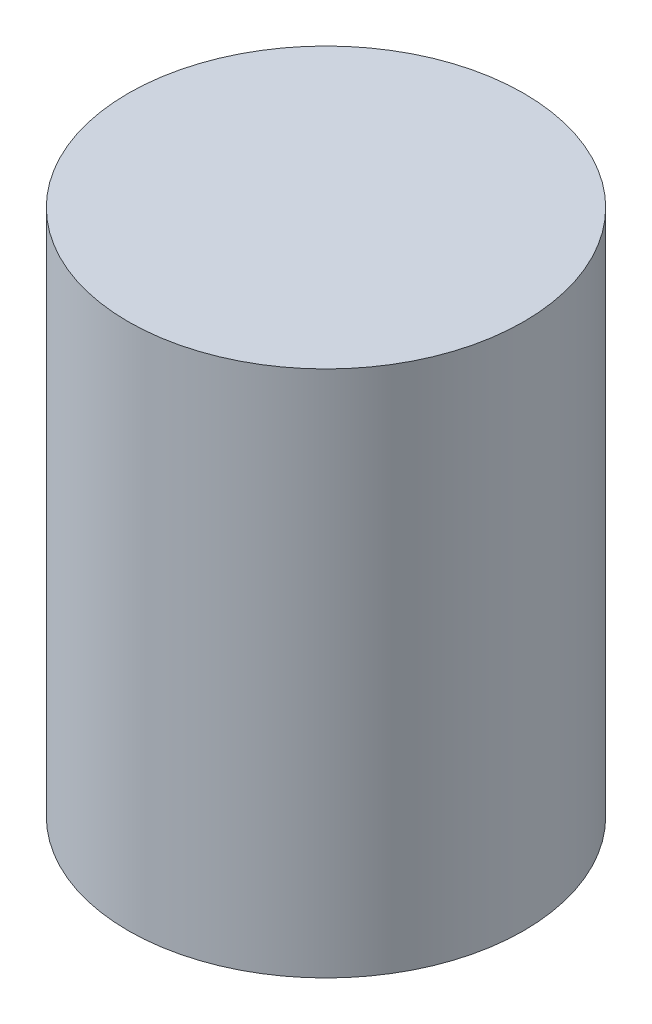
ISO-10303-21;
HEADER;
FILE_DESCRIPTION(('STEP AP214'),'2;1');
FILE_NAME('part.step','',(''),(''),'','','');
FILE_SCHEMA(('AUTOMOTIVE_DESIGN { 1 0 10303 214 1 1 1 1 }'));
ENDSEC;
DATA;
#1=APPLICATION_CONTEXT('core data for automotive mechanical design processes');
#2=APPLICATION_PROTOCOL_DEFINITION('international standard','automotive_design',2000,#1);
#3=PRODUCT_CONTEXT('',#1,'mechanical');
#4=PRODUCT('Part','Part','',(#3));
#5=PRODUCT_RELATED_PRODUCT_CATEGORY('part','',(#4));
#6=PRODUCT_DEFINITION_FORMATION('','',#4);
#7=PRODUCT_DEFINITION_CONTEXT('part definition',#1,'design');
#8=PRODUCT_DEFINITION('design','',#6,#7);
#9=PRODUCT_DEFINITION_SHAPE('','',#8);
#10=(LENGTH_UNIT() NAMED_UNIT(*) SI_UNIT(.MILLI.,.METRE.));
#11=(NAMED_UNIT(*) PLANE_ANGLE_UNIT() SI_UNIT($,.RADIAN.));
#12=(NAMED_UNIT(*) SI_UNIT($,.STERADIAN.) SOLID_ANGLE_UNIT());
#13=UNCERTAINTY_MEASURE_WITH_UNIT(LENGTH_MEASURE(1.E-05),#10,'distance_accuracy_value','');
#14=(GEOMETRIC_REPRESENTATION_CONTEXT(3) GLOBAL_UNCERTAINTY_ASSIGNED_CONTEXT((#13)) GLOBAL_UNIT_ASSIGNED_CONTEXT((#10,
#11,#12)) REPRESENTATION_CONTEXT('',''));
#15=CARTESIAN_POINT('',(0.,0.,0.));
#16=DIRECTION('',(0.,0.,1.));
#17=DIRECTION('',(1.,0.,0.));
#18=AXIS2_PLACEMENT_3D('',#15,#16,#17);
#19=CARTESIAN_POINT('',(0.,50.8,0.));
#20=DIRECTION('',(0.,-1.,0.));
#21=DIRECTION('',(0.,0.,-1.));
#22=AXIS2_PLACEMENT_3D('',#19,#20,#21);
#23=CYLINDRICAL_SURFACE('',#22,38.1);
#24=CARTESIAN_POINT('',(0.,50.8,0.));
#25=DIRECTION('',(0.,1.,0.));
#26=DIRECTION('',(0.,0.,1.));
#27=AXIS2_PLACEMENT_3D('',#24,#25,#26);
#28=CIRCLE('',#27,38.1);
#29=CARTESIAN_POINT('',(0.,50.8,38.1));
#30=VERTEX_POINT('',#29);
#31=EDGE_CURVE('E10',#30,#30,#28,.T.);
#32=ORIENTED_EDGE('',*,*,#31,.F.);
#33=EDGE_LOOP('',(#32));
#34=FACE_BOUND('',#33,.T.);
#35=CARTESIAN_POINT('',(0.,-50.8,0.));
#36=DIRECTION('',(0.,1.,0.));
#37=DIRECTION('',(0.,0.,1.));
#38=AXIS2_PLACEMENT_3D('',#35,#36,#37);
#39=CIRCLE('',#38,38.1);
#40=CARTESIAN_POINT('',(0.,-50.8,38.1));
#41=VERTEX_POINT('',#40);
#42=EDGE_CURVE('E42',#41,#41,#39,.T.);
#43=ORIENTED_EDGE('',*,*,#42,.T.);
#44=EDGE_LOOP('',(#43));
#45=FACE_BOUND('',#44,.T.);
#46=ADVANCED_FACE('F39',(#34,#45),#23,.T.);
#47=CARTESIAN_POINT('',(0.,50.8,0.));
#48=DIRECTION('',(0.,1.,0.));
#49=DIRECTION('',(0.,0.,1.));
#50=AXIS2_PLACEMENT_3D('',#47,#48,#49);
#51=PLANE('',#50);
#52=ORIENTED_EDGE('',*,*,#31,.T.);
#53=EDGE_LOOP('',(#52));
#54=FACE_BOUND('',#53,.T.);
#55=ADVANCED_FACE('F56',(#54),#51,.T.);
#56=CARTESIAN_POINT('',(0.,-50.8,0.));
#57=DIRECTION('',(0.,1.,0.));
#58=DIRECTION('',(0.,0.,1.));
#59=AXIS2_PLACEMENT_3D('',#56,#57,#58);
#60=PLANE('',#59);
#61=ORIENTED_EDGE('',*,*,#42,.F.);
#62=EDGE_LOOP('',(#61));
#63=FACE_BOUND('',#62,.T.);
#64=ADVANCED_FACE('F54',(#63),#60,.F.);
#65=CLOSED_SHELL('',(#46,#55,#64));
#66=MANIFOLD_SOLID_BREP('B2',#65);
#67=ADVANCED_BREP_SHAPE_REPRESENTATION('',(#18,#66),#14);
#68=SHAPE_DEFINITION_REPRESENTATION(#9,#67);
ENDSEC;
END-ISO-10303-21;
